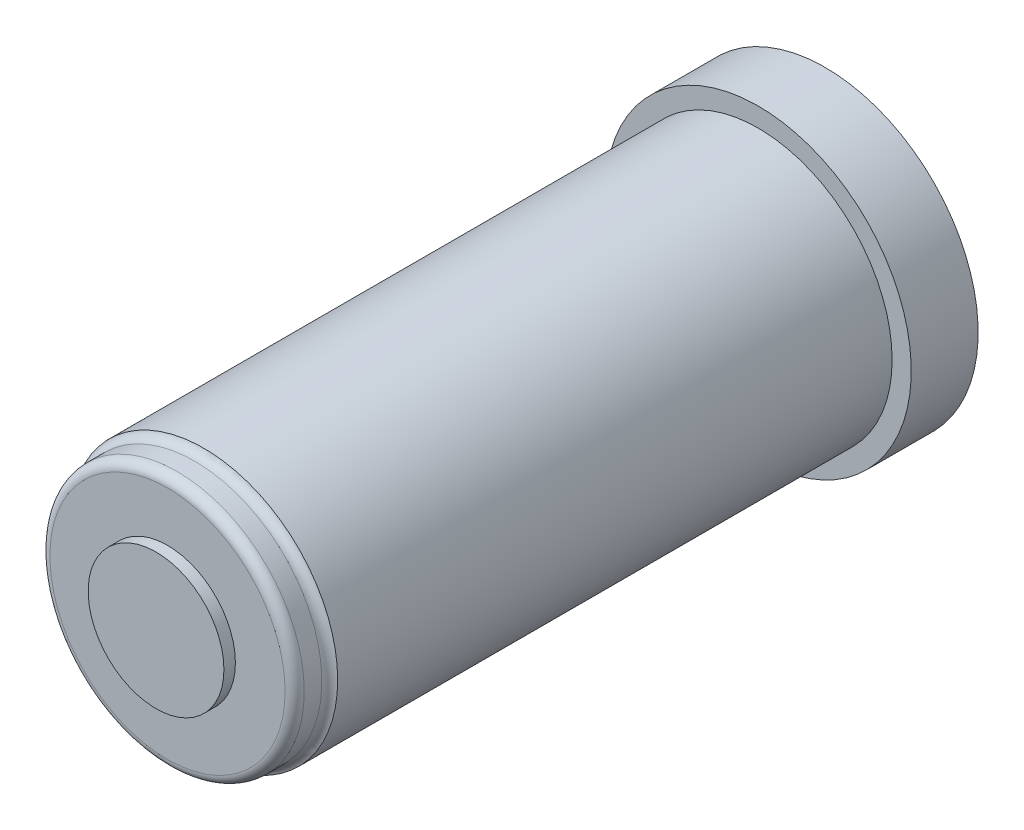
ISO-10303-21;
HEADER;
FILE_DESCRIPTION(('STEP AP214'),'2;1');
FILE_NAME('part.step','',(''),(''),'','','');
FILE_SCHEMA(('AUTOMOTIVE_DESIGN { 1 0 10303 214 1 1 1 1 }'));
ENDSEC;
DATA;
#1=APPLICATION_CONTEXT('core data for automotive mechanical design processes');
#2=APPLICATION_PROTOCOL_DEFINITION('international standard','automotive_design',2000,#1);
#3=PRODUCT_CONTEXT('',#1,'mechanical');
#4=PRODUCT('Part','Part','',(#3));
#5=PRODUCT_RELATED_PRODUCT_CATEGORY('part','',(#4));
#6=PRODUCT_DEFINITION_FORMATION('','',#4);
#7=PRODUCT_DEFINITION_CONTEXT('part definition',#1,'design');
#8=PRODUCT_DEFINITION('design','',#6,#7);
#9=PRODUCT_DEFINITION_SHAPE('','',#8);
#10=(LENGTH_UNIT() NAMED_UNIT(*) SI_UNIT(.MILLI.,.METRE.));
#11=(NAMED_UNIT(*) PLANE_ANGLE_UNIT() SI_UNIT($,.RADIAN.));
#12=(NAMED_UNIT(*) SI_UNIT($,.STERADIAN.) SOLID_ANGLE_UNIT());
#13=UNCERTAINTY_MEASURE_WITH_UNIT(LENGTH_MEASURE(1.E-05),#10,'distance_accuracy_value','');
#14=(GEOMETRIC_REPRESENTATION_CONTEXT(3) GLOBAL_UNCERTAINTY_ASSIGNED_CONTEXT((#13)) GLOBAL_UNIT_ASSIGNED_CONTEXT((#10,
#11,#12)) REPRESENTATION_CONTEXT('',''));
#15=CARTESIAN_POINT('',(0.,0.,0.));
#16=DIRECTION('',(0.,0.,1.));
#17=DIRECTION('',(1.,0.,0.));
#18=AXIS2_PLACEMENT_3D('',#15,#16,#17);
#19=CARTESIAN_POINT('',(0.,0.,-580.));
#20=DIRECTION('',(0.,0.,1.));
#21=DIRECTION('',(1.,0.,0.));
#22=AXIS2_PLACEMENT_3D('',#19,#20,#21);
#23=CYLINDRICAL_SURFACE('',#22,140.);
#24=CARTESIAN_POINT('',(0.,0.,-580.));
#25=DIRECTION('',(0.,0.,1.));
#26=DIRECTION('',(1.,0.,0.));
#27=AXIS2_PLACEMENT_3D('',#24,#25,#26);
#28=CIRCLE('',#27,140.);
#29=CARTESIAN_POINT('',(140.,0.,-580.));
#30=VERTEX_POINT('',#29);
#31=EDGE_CURVE('E63',#30,#30,#28,.T.);
#32=ORIENTED_EDGE('',*,*,#31,.T.);
#33=EDGE_LOOP('',(#32));
#34=FACE_BOUND('',#33,.T.);
#35=CARTESIAN_POINT('',(0.,0.,0.));
#36=DIRECTION('',(0.,0.,1.));
#37=DIRECTION('',(1.,0.,0.));
#38=AXIS2_PLACEMENT_3D('',#35,#36,#37);
#39=CIRCLE('',#38,140.);
#40=CARTESIAN_POINT('',(140.,0.,0.));
#41=VERTEX_POINT('',#40);
#42=EDGE_CURVE('E59',#41,#41,#39,.T.);
#43=ORIENTED_EDGE('',*,*,#42,.F.);
#44=EDGE_LOOP('',(#43));
#45=FACE_BOUND('',#44,.T.);
#46=ADVANCED_FACE('F35',(#34,#45),#23,.T.);
#47=CARTESIAN_POINT('',(0.,0.,38.));
#48=DIRECTION('',(0.,0.,-1.));
#49=DIRECTION('',(-1.,0.,0.));
#50=AXIS2_PLACEMENT_3D('',#47,#48,#49);
#51=CYLINDRICAL_SURFACE('',#50,133.);
#52=CARTESIAN_POINT('',(0.,0.,9.53939201416947));
#53=DIRECTION('',(0.,0.,-1.));
#54=DIRECTION('',(-1.,0.,0.));
#55=AXIS2_PLACEMENT_3D('',#52,#53,#54);
#56=CIRCLE('',#55,133.);
#57=CARTESIAN_POINT('',(-133.,0.,9.53939201416947));
#58=VERTEX_POINT('',#57);
#59=EDGE_CURVE('E50',#58,#58,#56,.F.);
#60=ORIENTED_EDGE('',*,*,#59,.T.);
#61=EDGE_LOOP('',(#60));
#62=FACE_BOUND('',#61,.T.);
#63=CARTESIAN_POINT('',(0.,0.,28.));
#64=DIRECTION('',(0.,0.,1.));
#65=DIRECTION('',(1.,0.,0.));
#66=AXIS2_PLACEMENT_3D('',#63,#64,#65);
#67=CIRCLE('',#66,133.);
#68=CARTESIAN_POINT('',(133.,0.,28.));
#69=VERTEX_POINT('',#68);
#70=EDGE_CURVE('E55',#69,#69,#67,.F.);
#71=ORIENTED_EDGE('',*,*,#70,.T.);
#72=EDGE_LOOP('',(#71));
#73=FACE_BOUND('',#72,.T.);
#74=ADVANCED_FACE('F96',(#62,#73),#51,.T.);
#75=CARTESIAN_POINT('',(0.,0.,38.));
#76=DIRECTION('',(0.,0.,1.));
#77=DIRECTION('',(1.,0.,0.));
#78=AXIS2_PLACEMENT_3D('',#75,#76,#77);
#79=PLANE('',#78);
#80=CARTESIAN_POINT('',(0.,0.,38.));
#81=DIRECTION('',(0.,0.,1.));
#82=DIRECTION('',(1.,0.,0.));
#83=AXIS2_PLACEMENT_3D('',#80,#81,#82);
#84=CIRCLE('',#83,123.);
#85=CARTESIAN_POINT('',(123.,0.,38.));
#86=VERTEX_POINT('',#85);
#87=EDGE_CURVE('E46',#86,#86,#84,.T.);
#88=ORIENTED_EDGE('',*,*,#87,.T.);
#89=EDGE_LOOP('',(#88));
#90=FACE_BOUND('',#89,.T.);
#91=CARTESIAN_POINT('',(0.,0.,38.));
#92=DIRECTION('',(0.,0.,1.));
#93=DIRECTION('',(1.,0.,0.));
#94=AXIS2_PLACEMENT_3D('',#91,#92,#93);
#95=CIRCLE('',#94,71.);
#96=CARTESIAN_POINT('',(71.,0.,38.));
#97=VERTEX_POINT('',#96);
#98=EDGE_CURVE('E58',#97,#97,#95,.T.);
#99=ORIENTED_EDGE('',*,*,#98,.F.);
#100=EDGE_LOOP('',(#99));
#101=FACE_BOUND('',#100,.T.);
#102=ADVANCED_FACE('F102',(#90,#101),#79,.T.);
#103=CARTESIAN_POINT('',(0.,0.,50.));
#104=DIRECTION('',(0.,0.,-1.));
#105=DIRECTION('',(-1.,0.,0.));
#106=AXIS2_PLACEMENT_3D('',#103,#104,#105);
#107=CYLINDRICAL_SURFACE('',#106,71.);
#108=CARTESIAN_POINT('',(0.,0.,50.));
#109=DIRECTION('',(0.,0.,1.));
#110=DIRECTION('',(1.,0.,0.));
#111=AXIS2_PLACEMENT_3D('',#108,#109,#110);
#112=CIRCLE('',#111,71.);
#113=CARTESIAN_POINT('',(71.,0.,50.));
#114=VERTEX_POINT('',#113);
#115=EDGE_CURVE('E62',#114,#114,#112,.T.);
#116=ORIENTED_EDGE('',*,*,#115,.F.);
#117=EDGE_LOOP('',(#116));
#118=FACE_BOUND('',#117,.T.);
#119=ORIENTED_EDGE('',*,*,#98,.T.);
#120=EDGE_LOOP('',(#119));
#121=FACE_BOUND('',#120,.T.);
#122=ADVANCED_FACE('F127',(#118,#121),#107,.T.);
#123=CARTESIAN_POINT('',(0.,0.,50.));
#124=DIRECTION('',(0.,0.,1.));
#125=DIRECTION('',(1.,0.,0.));
#126=AXIS2_PLACEMENT_3D('',#123,#124,#125);
#127=PLANE('',#126);
#128=ORIENTED_EDGE('',*,*,#115,.T.);
#129=EDGE_LOOP('',(#128));
#130=FACE_BOUND('',#129,.T.);
#131=ADVANCED_FACE('F111',(#130),#127,.T.);
#132=CARTESIAN_POINT('',(0.,0.,9.53939201416947));
#133=DIRECTION('',(0.,0.,-1.));
#134=DIRECTION('',(-1.,0.,0.));
#135=AXIS2_PLACEMENT_3D('',#132,#133,#134);
#136=TOROIDAL_SURFACE('',#135,143.,10.);
#137=ORIENTED_EDGE('',*,*,#42,.T.);
#138=EDGE_LOOP('',(#137));
#139=FACE_BOUND('',#138,.T.);
#140=ORIENTED_EDGE('',*,*,#59,.F.);
#141=EDGE_LOOP('',(#140));
#142=FACE_BOUND('',#141,.T.);
#143=ADVANCED_FACE('F108',(#139,#142),#136,.F.);
#144=CARTESIAN_POINT('',(0.,0.,28.));
#145=DIRECTION('',(0.,0.,1.));
#146=DIRECTION('',(1.,0.,0.));
#147=AXIS2_PLACEMENT_3D('',#144,#145,#146);
#148=TOROIDAL_SURFACE('',#147,123.,10.);
#149=ORIENTED_EDGE('',*,*,#70,.F.);
#150=EDGE_LOOP('',(#149));
#151=FACE_BOUND('',#150,.T.);
#152=ORIENTED_EDGE('',*,*,#87,.F.);
#153=EDGE_LOOP('',(#152));
#154=FACE_BOUND('',#153,.T.);
#155=ADVANCED_FACE('F110',(#151,#154),#148,.T.);
#156=CARTESIAN_POINT('',(0.,0.,-650.));
#157=DIRECTION('',(0.,0.,1.));
#158=DIRECTION('',(1.,0.,0.));
#159=AXIS2_PLACEMENT_3D('',#156,#157,#158);
#160=CYLINDRICAL_SURFACE('',#159,160.);
#161=CARTESIAN_POINT('',(0.,0.,-650.));
#162=DIRECTION('',(0.,0.,-1.));
#163=DIRECTION('',(-1.,0.,0.));
#164=AXIS2_PLACEMENT_3D('',#161,#162,#163);
#165=CIRCLE('',#164,160.);
#166=CARTESIAN_POINT('',(-160.,0.,-650.));
#167=VERTEX_POINT('',#166);
#168=EDGE_CURVE('E66',#167,#167,#165,.T.);
#169=ORIENTED_EDGE('',*,*,#168,.F.);
#170=EDGE_LOOP('',(#169));
#171=FACE_BOUND('',#170,.T.);
#172=CARTESIAN_POINT('',(0.,0.,-580.));
#173=DIRECTION('',(0.,0.,-1.));
#174=DIRECTION('',(-1.,0.,0.));
#175=AXIS2_PLACEMENT_3D('',#172,#173,#174);
#176=CIRCLE('',#175,160.);
#177=CARTESIAN_POINT('',(-160.,0.,-580.));
#178=VERTEX_POINT('',#177);
#179=EDGE_CURVE('E71',#178,#178,#176,.T.);
#180=ORIENTED_EDGE('',*,*,#179,.T.);
#181=EDGE_LOOP('',(#180));
#182=FACE_BOUND('',#181,.T.);
#183=ADVANCED_FACE('F114',(#171,#182),#160,.T.);
#184=CARTESIAN_POINT('',(0.,0.,-650.));
#185=DIRECTION('',(0.,0.,-1.));
#186=DIRECTION('',(-1.,0.,0.));
#187=AXIS2_PLACEMENT_3D('',#184,#185,#186);
#188=PLANE('',#187);
#189=CARTESIAN_POINT('',(0.,0.,-650.));
#190=DIRECTION('',(0.,0.,-1.));
#191=DIRECTION('',(-1.,0.,0.));
#192=AXIS2_PLACEMENT_3D('',#189,#190,#191);
#193=CIRCLE('',#192,78.74);
#194=CARTESIAN_POINT('',(-78.74,0.,-650.));
#195=VERTEX_POINT('',#194);
#196=EDGE_CURVE('E10',#195,#195,#193,.F.);
#197=ORIENTED_EDGE('',*,*,#196,.T.);
#198=EDGE_LOOP('',(#197));
#199=FACE_BOUND('',#198,.T.);
#200=ORIENTED_EDGE('',*,*,#168,.T.);
#201=EDGE_LOOP('',(#200));
#202=FACE_BOUND('',#201,.T.);
#203=ADVANCED_FACE('F91',(#199,#202),#188,.T.);
#204=CARTESIAN_POINT('',(0.,0.,-580.));
#205=DIRECTION('',(0.,0.,-1.));
#206=DIRECTION('',(-1.,0.,0.));
#207=AXIS2_PLACEMENT_3D('',#204,#205,#206);
#208=PLANE('',#207);
#209=ORIENTED_EDGE('',*,*,#31,.F.);
#210=EDGE_LOOP('',(#209));
#211=FACE_BOUND('',#210,.T.);
#212=ORIENTED_EDGE('',*,*,#179,.F.);
#213=EDGE_LOOP('',(#212));
#214=FACE_BOUND('',#213,.T.);
#215=ADVANCED_FACE('F84',(#211,#214),#208,.F.);
#216=CARTESIAN_POINT('',(0.,0.,-636.));
#217=DIRECTION('',(0.,0.,-1.));
#218=DIRECTION('',(-1.,0.,0.));
#219=AXIS2_PLACEMENT_3D('',#216,#217,#218);
#220=CYLINDRICAL_SURFACE('',#219,68.74);
#221=CARTESIAN_POINT('',(0.,0.,-640.));
#222=DIRECTION('',(0.,0.,-1.));
#223=DIRECTION('',(-1.,0.,0.));
#224=AXIS2_PLACEMENT_3D('',#221,#222,#223);
#225=CIRCLE('',#224,68.74);
#226=CARTESIAN_POINT('',(-68.74,0.,-640.));
#227=VERTEX_POINT('',#226);
#228=EDGE_CURVE('E42',#227,#227,#225,.T.);
#229=ORIENTED_EDGE('',*,*,#228,.T.);
#230=EDGE_LOOP('',(#229));
#231=FACE_BOUND('',#230,.T.);
#232=CARTESIAN_POINT('',(0.,0.,-636.));
#233=DIRECTION('',(0.,0.,-1.));
#234=DIRECTION('',(-1.,0.,0.));
#235=AXIS2_PLACEMENT_3D('',#232,#233,#234);
#236=CIRCLE('',#235,68.74);
#237=CARTESIAN_POINT('',(-68.74,0.,-636.));
#238=VERTEX_POINT('',#237);
#239=EDGE_CURVE('E74',#238,#238,#236,.T.);
#240=ORIENTED_EDGE('',*,*,#239,.F.);
#241=EDGE_LOOP('',(#240));
#242=FACE_BOUND('',#241,.T.);
#243=ADVANCED_FACE('F82',(#231,#242),#220,.F.);
#244=CARTESIAN_POINT('',(0.,0.,-636.));
#245=DIRECTION('',(0.,0.,-1.));
#246=DIRECTION('',(-1.,0.,0.));
#247=AXIS2_PLACEMENT_3D('',#244,#245,#246);
#248=PLANE('',#247);
#249=ORIENTED_EDGE('',*,*,#239,.T.);
#250=EDGE_LOOP('',(#249));
#251=FACE_BOUND('',#250,.T.);
#252=ADVANCED_FACE('F80',(#251),#248,.T.);
#253=CARTESIAN_POINT('',(0.,0.,-640.));
#254=DIRECTION('',(0.,0.,-1.));
#255=DIRECTION('',(-1.,0.,0.));
#256=AXIS2_PLACEMENT_3D('',#253,#254,#255);
#257=TOROIDAL_SURFACE('',#256,78.74,10.);
#258=ORIENTED_EDGE('',*,*,#196,.F.);
#259=EDGE_LOOP('',(#258));
#260=FACE_BOUND('',#259,.T.);
#261=ORIENTED_EDGE('',*,*,#228,.F.);
#262=EDGE_LOOP('',(#261));
#263=FACE_BOUND('',#262,.T.);
#264=ADVANCED_FACE('F37',(#260,#263),#257,.T.);
#265=CLOSED_SHELL('',(#46,#74,#102,#122,#131,#143,#155,#183,#203,#215,#243,#252,#264));
#266=MANIFOLD_SOLID_BREP('B2',#265);
#267=ADVANCED_BREP_SHAPE_REPRESENTATION('',(#18,#266),#14);
#268=SHAPE_DEFINITION_REPRESENTATION(#9,#267);
ENDSEC;
END-ISO-10303-21;
